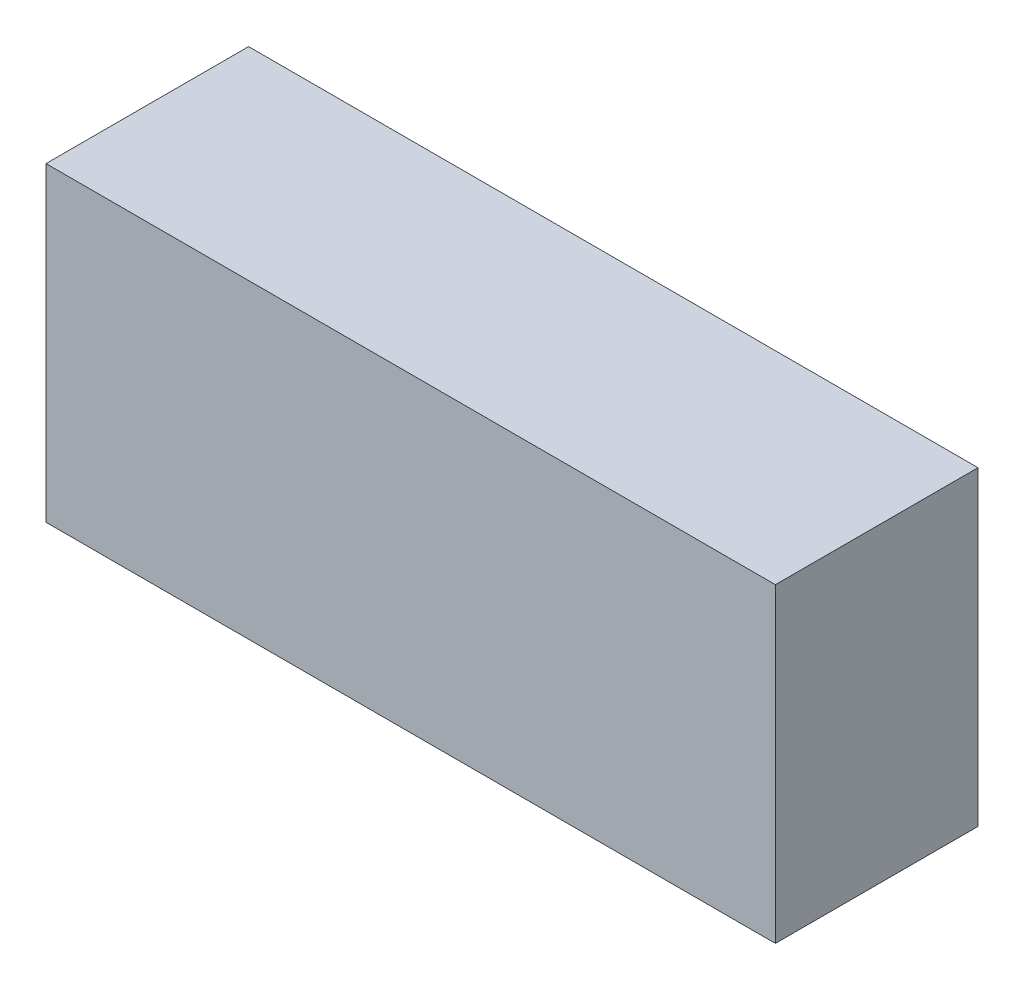
ISO-10303-21;
HEADER;
FILE_DESCRIPTION(('STEP AP214'),'2;1');
FILE_NAME('part.step','',(''),(''),'','','');
FILE_SCHEMA(('AUTOMOTIVE_DESIGN { 1 0 10303 214 1 1 1 1 }'));
ENDSEC;
DATA;
#1=APPLICATION_CONTEXT('core data for automotive mechanical design processes');
#2=APPLICATION_PROTOCOL_DEFINITION('international standard','automotive_design',2000,#1);
#3=PRODUCT_CONTEXT('',#1,'mechanical');
#4=PRODUCT('Part','Part','',(#3));
#5=PRODUCT_RELATED_PRODUCT_CATEGORY('part','',(#4));
#6=PRODUCT_DEFINITION_FORMATION('','',#4);
#7=PRODUCT_DEFINITION_CONTEXT('part definition',#1,'design');
#8=PRODUCT_DEFINITION('design','',#6,#7);
#9=PRODUCT_DEFINITION_SHAPE('','',#8);
#10=(LENGTH_UNIT() NAMED_UNIT(*) SI_UNIT(.MILLI.,.METRE.));
#11=(NAMED_UNIT(*) PLANE_ANGLE_UNIT() SI_UNIT($,.RADIAN.));
#12=(NAMED_UNIT(*) SI_UNIT($,.STERADIAN.) SOLID_ANGLE_UNIT());
#13=UNCERTAINTY_MEASURE_WITH_UNIT(LENGTH_MEASURE(1.E-05),#10,'distance_accuracy_value','');
#14=(GEOMETRIC_REPRESENTATION_CONTEXT(3) GLOBAL_UNCERTAINTY_ASSIGNED_CONTEXT((#13)) GLOBAL_UNIT_ASSIGNED_CONTEXT((#10,
#11,#12)) REPRESENTATION_CONTEXT('',''));
#15=CARTESIAN_POINT('',(0.,0.,0.));
#16=DIRECTION('',(0.,0.,1.));
#17=DIRECTION('',(1.,0.,0.));
#18=AXIS2_PLACEMENT_3D('',#15,#16,#17);
#19=CARTESIAN_POINT('',(0.,23.,15.));
#20=DIRECTION('',(1.,0.,0.));
#21=DIRECTION('',(0.,0.,-1.));
#22=AXIS2_PLACEMENT_3D('',#19,#20,#21);
#23=PLANE('',#22);
#24=DIRECTION('',(0.,-1.,0.));
#25=VECTOR('',#24,1.);
#26=CARTESIAN_POINT('',(0.,23.,0.));
#27=LINE('',#26,#25);
#28=CARTESIAN_POINT('',(0.,23.,0.));
#29=VERTEX_POINT('',#28);
#30=CARTESIAN_POINT('',(0.,0.,0.));
#31=VERTEX_POINT('',#30);
#32=EDGE_CURVE('E95',#29,#31,#27,.T.);
#33=ORIENTED_EDGE('',*,*,#32,.T.);
#34=DIRECTION('',(0.,0.,-1.));
#35=VECTOR('',#34,1.);
#36=CARTESIAN_POINT('',(0.,0.,15.));
#37=LINE('',#36,#35);
#38=CARTESIAN_POINT('',(0.,0.,15.));
#39=VERTEX_POINT('',#38);
#40=EDGE_CURVE('E11',#39,#31,#37,.T.);
#41=ORIENTED_EDGE('',*,*,#40,.F.);
#42=DIRECTION('',(0.,-1.,0.));
#43=VECTOR('',#42,1.);
#44=CARTESIAN_POINT('',(0.,23.,15.));
#45=LINE('',#44,#43);
#46=CARTESIAN_POINT('',(0.,23.,15.));
#47=VERTEX_POINT('',#46);
#48=EDGE_CURVE('E83',#47,#39,#45,.T.);
#49=ORIENTED_EDGE('',*,*,#48,.F.);
#50=DIRECTION('',(0.,0.,-1.));
#51=VECTOR('',#50,1.);
#52=CARTESIAN_POINT('',(0.,23.,15.));
#53=LINE('',#52,#51);
#54=EDGE_CURVE('E91',#47,#29,#53,.T.);
#55=ORIENTED_EDGE('',*,*,#54,.T.);
#56=EDGE_LOOP('',(#33,#41,#49,#55));
#57=FACE_BOUND('',#56,.T.);
#58=ADVANCED_FACE('F32',(#57),#23,.F.);
#59=CARTESIAN_POINT('',(0.,0.,15.));
#60=DIRECTION('',(0.,1.,0.));
#61=DIRECTION('',(0.,0.,1.));
#62=AXIS2_PLACEMENT_3D('',#59,#60,#61);
#63=PLANE('',#62);
#64=DIRECTION('',(1.,0.,0.));
#65=VECTOR('',#64,1.);
#66=CARTESIAN_POINT('',(0.,0.,0.));
#67=LINE('',#66,#65);
#68=CARTESIAN_POINT('',(54.,0.,0.));
#69=VERTEX_POINT('',#68);
#70=EDGE_CURVE('E87',#31,#69,#67,.T.);
#71=ORIENTED_EDGE('',*,*,#70,.T.);
#72=DIRECTION('',(0.,0.,-1.));
#73=VECTOR('',#72,1.);
#74=CARTESIAN_POINT('',(54.,0.,15.));
#75=LINE('',#74,#73);
#76=CARTESIAN_POINT('',(54.,0.,15.));
#77=VERTEX_POINT('',#76);
#78=EDGE_CURVE('E40',#77,#69,#75,.T.);
#79=ORIENTED_EDGE('',*,*,#78,.F.);
#80=DIRECTION('',(1.,0.,0.));
#81=VECTOR('',#80,1.);
#82=CARTESIAN_POINT('',(0.,0.,15.));
#83=LINE('',#82,#81);
#84=EDGE_CURVE('E78',#39,#77,#83,.T.);
#85=ORIENTED_EDGE('',*,*,#84,.F.);
#86=ORIENTED_EDGE('',*,*,#40,.T.);
#87=EDGE_LOOP('',(#71,#79,#85,#86));
#88=FACE_BOUND('',#87,.T.);
#89=ADVANCED_FACE('F86',(#88),#63,.F.);
#90=CARTESIAN_POINT('',(54.,0.,15.));
#91=DIRECTION('',(-1.,0.,0.));
#92=DIRECTION('',(0.,0.,1.));
#93=AXIS2_PLACEMENT_3D('',#90,#91,#92);
#94=PLANE('',#93);
#95=DIRECTION('',(0.,1.,0.));
#96=VECTOR('',#95,1.);
#97=CARTESIAN_POINT('',(54.,0.,0.));
#98=LINE('',#97,#96);
#99=CARTESIAN_POINT('',(54.,23.,0.));
#100=VERTEX_POINT('',#99);
#101=EDGE_CURVE('E65',#69,#100,#98,.T.);
#102=ORIENTED_EDGE('',*,*,#101,.T.);
#103=DIRECTION('',(0.,0.,-1.));
#104=VECTOR('',#103,1.);
#105=CARTESIAN_POINT('',(54.,23.,15.));
#106=LINE('',#105,#104);
#107=CARTESIAN_POINT('',(54.,23.,15.));
#108=VERTEX_POINT('',#107);
#109=EDGE_CURVE('E88',#108,#100,#106,.T.);
#110=ORIENTED_EDGE('',*,*,#109,.F.);
#111=DIRECTION('',(0.,1.,0.));
#112=VECTOR('',#111,1.);
#113=CARTESIAN_POINT('',(54.,0.,15.));
#114=LINE('',#113,#112);
#115=EDGE_CURVE('E81',#77,#108,#114,.T.);
#116=ORIENTED_EDGE('',*,*,#115,.F.);
#117=ORIENTED_EDGE('',*,*,#78,.T.);
#118=EDGE_LOOP('',(#102,#110,#116,#117));
#119=FACE_BOUND('',#118,.T.);
#120=ADVANCED_FACE('F89',(#119),#94,.F.);
#121=CARTESIAN_POINT('',(54.,23.,15.));
#122=DIRECTION('',(0.,-1.,0.));
#123=DIRECTION('',(1.,0.,0.));
#124=AXIS2_PLACEMENT_3D('',#121,#122,#123);
#125=PLANE('',#124);
#126=DIRECTION('',(-1.,0.,0.));
#127=VECTOR('',#126,1.);
#128=CARTESIAN_POINT('',(54.,23.,0.));
#129=LINE('',#128,#127);
#130=EDGE_CURVE('E71',#100,#29,#129,.T.);
#131=ORIENTED_EDGE('',*,*,#130,.T.);
#132=ORIENTED_EDGE('',*,*,#54,.F.);
#133=DIRECTION('',(-1.,0.,0.));
#134=VECTOR('',#133,1.);
#135=CARTESIAN_POINT('',(54.,23.,15.));
#136=LINE('',#135,#134);
#137=EDGE_CURVE('E48',#108,#47,#136,.T.);
#138=ORIENTED_EDGE('',*,*,#137,.F.);
#139=ORIENTED_EDGE('',*,*,#109,.T.);
#140=EDGE_LOOP('',(#131,#132,#138,#139));
#141=FACE_BOUND('',#140,.T.);
#142=ADVANCED_FACE('F102',(#141),#125,.F.);
#143=CARTESIAN_POINT('',(0.,0.,15.));
#144=DIRECTION('',(0.,0.,1.));
#145=DIRECTION('',(1.,0.,0.));
#146=AXIS2_PLACEMENT_3D('',#143,#144,#145);
#147=PLANE('',#146);
#148=ORIENTED_EDGE('',*,*,#48,.T.);
#149=ORIENTED_EDGE('',*,*,#84,.T.);
#150=ORIENTED_EDGE('',*,*,#115,.T.);
#151=ORIENTED_EDGE('',*,*,#137,.T.);
#152=EDGE_LOOP('',(#148,#149,#150,#151));
#153=FACE_BOUND('',#152,.T.);
#154=ADVANCED_FACE('F79',(#153),#147,.T.);
#155=CARTESIAN_POINT('',(0.,0.,0.));
#156=DIRECTION('',(0.,0.,1.));
#157=DIRECTION('',(1.,0.,0.));
#158=AXIS2_PLACEMENT_3D('',#155,#156,#157);
#159=PLANE('',#158);
#160=ORIENTED_EDGE('',*,*,#32,.F.);
#161=ORIENTED_EDGE('',*,*,#130,.F.);
#162=ORIENTED_EDGE('',*,*,#101,.F.);
#163=ORIENTED_EDGE('',*,*,#70,.F.);
#164=EDGE_LOOP('',(#160,#161,#162,#163));
#165=FACE_BOUND('',#164,.T.);
#166=ADVANCED_FACE('F105',(#165),#159,.F.);
#167=CLOSED_SHELL('',(#58,#89,#120,#142,#154,#166));
#168=MANIFOLD_SOLID_BREP('B2',#167);
#169=ADVANCED_BREP_SHAPE_REPRESENTATION('',(#18,#168),#14);
#170=SHAPE_DEFINITION_REPRESENTATION(#9,#169);
ENDSEC;
END-ISO-10303-21;
